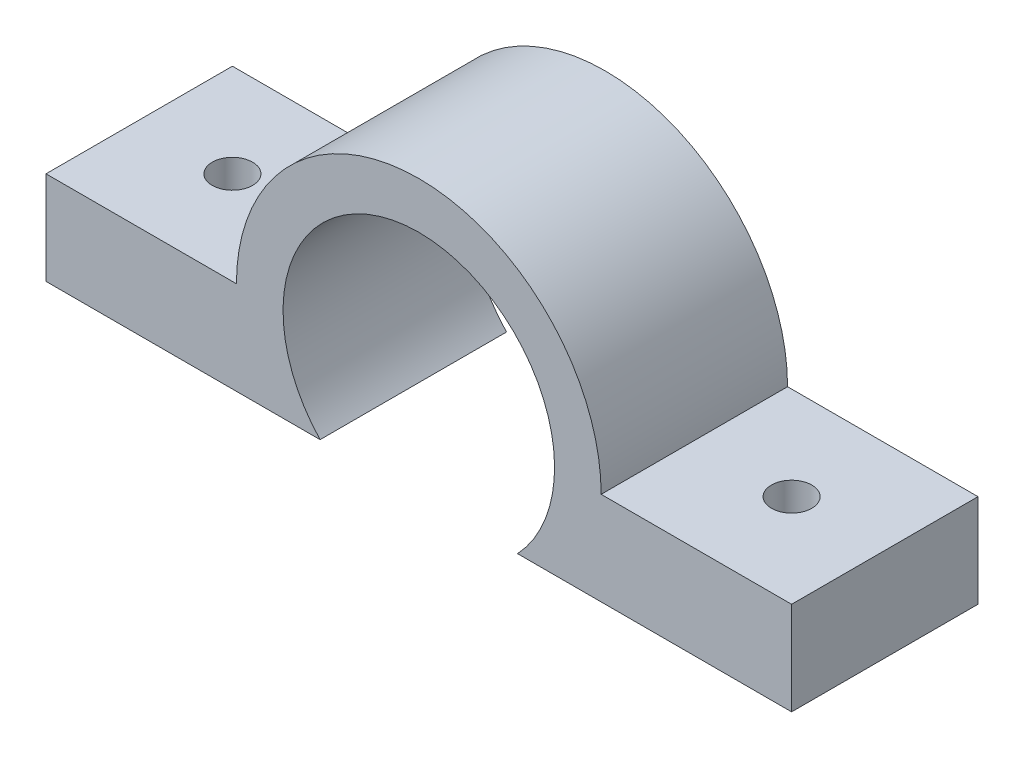
ISO-10303-21;
HEADER;
FILE_DESCRIPTION(('STEP AP214'),'2;1');
FILE_NAME('part.step','',(''),(''),'','','');
FILE_SCHEMA(('AUTOMOTIVE_DESIGN { 1 0 10303 214 1 1 1 1 }'));
ENDSEC;
DATA;
#1=APPLICATION_CONTEXT('core data for automotive mechanical design processes');
#2=APPLICATION_PROTOCOL_DEFINITION('international standard','automotive_design',2000,#1);
#3=PRODUCT_CONTEXT('',#1,'mechanical');
#4=PRODUCT('Part','Part','',(#3));
#5=PRODUCT_RELATED_PRODUCT_CATEGORY('part','',(#4));
#6=PRODUCT_DEFINITION_FORMATION('','',#4);
#7=PRODUCT_DEFINITION_CONTEXT('part definition',#1,'design');
#8=PRODUCT_DEFINITION('design','',#6,#7);
#9=PRODUCT_DEFINITION_SHAPE('','',#8);
#10=(LENGTH_UNIT() NAMED_UNIT(*) SI_UNIT(.MILLI.,.METRE.));
#11=(NAMED_UNIT(*) PLANE_ANGLE_UNIT() SI_UNIT($,.RADIAN.));
#12=(NAMED_UNIT(*) SI_UNIT($,.STERADIAN.) SOLID_ANGLE_UNIT());
#13=UNCERTAINTY_MEASURE_WITH_UNIT(LENGTH_MEASURE(1.E-05),#10,'distance_accuracy_value','');
#14=(GEOMETRIC_REPRESENTATION_CONTEXT(3) GLOBAL_UNCERTAINTY_ASSIGNED_CONTEXT((#13)) GLOBAL_UNIT_ASSIGNED_CONTEXT((#10,
#11,#12)) REPRESENTATION_CONTEXT('',''));
#15=CARTESIAN_POINT('',(0.,0.,0.));
#16=DIRECTION('',(0.,0.,1.));
#17=DIRECTION('',(1.,0.,0.));
#18=AXIS2_PLACEMENT_3D('',#15,#16,#17);
#19=CARTESIAN_POINT('',(0.,6.35,25.4));
#20=DIRECTION('',(0.,-1.,0.));
#21=DIRECTION('',(1.,0.,0.));
#22=AXIS2_PLACEMENT_3D('',#19,#20,#21);
#23=PLANE('',#22);
#24=CARTESIAN_POINT('',(-38.1,6.34999999999997,12.7));
#25=DIRECTION('',(0.,1.,0.));
#26=DIRECTION('',(0.,0.,1.));
#27=AXIS2_PLACEMENT_3D('',#24,#25,#26);
#28=CIRCLE('',#27,2.75);
#29=CARTESIAN_POINT('',(-38.1,6.34999999999997,15.45));
#30=VERTEX_POINT('',#29);
#31=EDGE_CURVE('E146',#30,#30,#28,.T.);
#32=ORIENTED_EDGE('',*,*,#31,.T.);
#33=EDGE_LOOP('',(#32));
#34=FACE_BOUND('',#33,.T.);
#35=DIRECTION('',(-1.,0.,0.));
#36=VECTOR('',#35,1.);
#37=CARTESIAN_POINT('',(0.,6.35,0.));
#38=LINE('',#37,#36);
#39=CARTESIAN_POINT('',(-13.4521373766402,6.35,0.));
#40=VERTEX_POINT('',#39);
#41=CARTESIAN_POINT('',(-50.8,6.34999999999999,0.));
#42=VERTEX_POINT('',#41);
#43=EDGE_CURVE('E141',#40,#42,#38,.T.);
#44=ORIENTED_EDGE('',*,*,#43,.F.);
#45=DIRECTION('',(0.,0.,-1.));
#46=VECTOR('',#45,1.);
#47=CARTESIAN_POINT('',(-13.4521373766402,6.35,25.4));
#48=LINE('',#47,#46);
#49=CARTESIAN_POINT('',(-13.4521373766402,6.35,25.4));
#50=VERTEX_POINT('',#49);
#51=EDGE_CURVE('E11',#50,#40,#48,.T.);
#52=ORIENTED_EDGE('',*,*,#51,.F.);
#53=DIRECTION('',(-1.,0.,0.));
#54=VECTOR('',#53,1.);
#55=CARTESIAN_POINT('',(0.,6.35,25.4));
#56=LINE('',#55,#54);
#57=CARTESIAN_POINT('',(-50.8,6.34999999999999,25.4));
#58=VERTEX_POINT('',#57);
#59=EDGE_CURVE('E167',#50,#58,#56,.T.);
#60=ORIENTED_EDGE('',*,*,#59,.T.);
#61=DIRECTION('',(0.,0.,-1.));
#62=VECTOR('',#61,1.);
#63=CARTESIAN_POINT('',(-50.8,6.34999999999999,25.4));
#64=LINE('',#63,#62);
#65=EDGE_CURVE('E93',#58,#42,#64,.T.);
#66=ORIENTED_EDGE('',*,*,#65,.T.);
#67=EDGE_LOOP('',(#44,#52,#60,#66));
#68=FACE_BOUND('',#67,.T.);
#69=ADVANCED_FACE('F41',(#34,#68),#23,.T.);
#70=CARTESIAN_POINT('',(0.,19.05,25.4));
#71=DIRECTION('',(0.,0.,-1.));
#72=DIRECTION('',(-1.,0.,0.));
#73=AXIS2_PLACEMENT_3D('',#70,#71,#72);
#74=CYLINDRICAL_SURFACE('',#73,18.5);
#75=CARTESIAN_POINT('',(0.,19.05,0.));
#76=DIRECTION('',(0.,0.,1.));
#77=DIRECTION('',(1.,0.,0.));
#78=AXIS2_PLACEMENT_3D('',#75,#76,#77);
#79=CIRCLE('',#78,18.5);
#80=CARTESIAN_POINT('',(13.4521373766402,6.35,0.));
#81=VERTEX_POINT('',#80);
#82=EDGE_CURVE('E145',#40,#81,#79,.F.);
#83=ORIENTED_EDGE('',*,*,#82,.T.);
#84=DIRECTION('',(0.,0.,-1.));
#85=VECTOR('',#84,1.);
#86=CARTESIAN_POINT('',(13.4521373766402,6.35,25.4));
#87=LINE('',#86,#85);
#88=CARTESIAN_POINT('',(13.4521373766402,6.35,25.4));
#89=VERTEX_POINT('',#88);
#90=EDGE_CURVE('E51',#89,#81,#87,.T.);
#91=ORIENTED_EDGE('',*,*,#90,.F.);
#92=CARTESIAN_POINT('',(0.,19.05,25.4));
#93=DIRECTION('',(0.,0.,1.));
#94=DIRECTION('',(1.,0.,0.));
#95=AXIS2_PLACEMENT_3D('',#92,#93,#94);
#96=CIRCLE('',#95,18.5);
#97=EDGE_CURVE('E214',#50,#89,#96,.F.);
#98=ORIENTED_EDGE('',*,*,#97,.F.);
#99=ORIENTED_EDGE('',*,*,#51,.T.);
#100=EDGE_LOOP('',(#83,#91,#98,#99));
#101=FACE_BOUND('',#100,.T.);
#102=ADVANCED_FACE('F43',(#101),#74,.F.);
#103=CARTESIAN_POINT('',(38.1,6.35000000000001,12.7));
#104=DIRECTION('',(0.,1.,0.));
#105=DIRECTION('',(0.,0.,1.));
#106=AXIS2_PLACEMENT_3D('',#103,#104,#105);
#107=CIRCLE('',#106,2.75);
#108=CARTESIAN_POINT('',(38.1,6.35000000000001,15.45));
#109=VERTEX_POINT('',#108);
#110=EDGE_CURVE('E201',#109,#109,#107,.T.);
#111=ORIENTED_EDGE('',*,*,#110,.T.);
#112=EDGE_LOOP('',(#111));
#113=FACE_BOUND('',#112,.T.);
#114=CARTESIAN_POINT('',(50.8,6.35000000000001,0.));
#115=VERTEX_POINT('',#114);
#116=EDGE_CURVE('E147',#115,#81,#38,.T.);
#117=ORIENTED_EDGE('',*,*,#116,.F.);
#118=DIRECTION('',(0.,0.,-1.));
#119=VECTOR('',#118,1.);
#120=CARTESIAN_POINT('',(50.8,6.35000000000001,25.4));
#121=LINE('',#120,#119);
#122=CARTESIAN_POINT('',(50.8,6.35000000000001,25.4));
#123=VERTEX_POINT('',#122);
#124=EDGE_CURVE('E177',#123,#115,#121,.T.);
#125=ORIENTED_EDGE('',*,*,#124,.F.);
#126=EDGE_CURVE('E187',#123,#89,#56,.T.);
#127=ORIENTED_EDGE('',*,*,#126,.T.);
#128=ORIENTED_EDGE('',*,*,#90,.T.);
#129=EDGE_LOOP('',(#117,#125,#127,#128));
#130=FACE_BOUND('',#129,.T.);
#131=ADVANCED_FACE('F184',(#113,#130),#23,.T.);
#132=CARTESIAN_POINT('',(50.8,0.,25.4));
#133=DIRECTION('',(1.,0.,0.));
#134=DIRECTION('',(0.,0.,-1.));
#135=AXIS2_PLACEMENT_3D('',#132,#133,#134);
#136=PLANE('',#135);
#137=DIRECTION('',(0.,-1.,0.));
#138=VECTOR('',#137,1.);
#139=CARTESIAN_POINT('',(50.8,0.,0.));
#140=LINE('',#139,#138);
#141=CARTESIAN_POINT('',(50.8,19.05,0.));
#142=VERTEX_POINT('',#141);
#143=EDGE_CURVE('E151',#142,#115,#140,.T.);
#144=ORIENTED_EDGE('',*,*,#143,.F.);
#145=DIRECTION('',(0.,0.,-1.));
#146=VECTOR('',#145,1.);
#147=CARTESIAN_POINT('',(50.8,19.05,25.4));
#148=LINE('',#147,#146);
#149=CARTESIAN_POINT('',(50.8,19.05,25.4));
#150=VERTEX_POINT('',#149);
#151=EDGE_CURVE('E174',#150,#142,#148,.T.);
#152=ORIENTED_EDGE('',*,*,#151,.F.);
#153=DIRECTION('',(0.,-1.,0.));
#154=VECTOR('',#153,1.);
#155=CARTESIAN_POINT('',(50.8,0.,25.4));
#156=LINE('',#155,#154);
#157=EDGE_CURVE('E217',#150,#123,#156,.T.);
#158=ORIENTED_EDGE('',*,*,#157,.T.);
#159=ORIENTED_EDGE('',*,*,#124,.T.);
#160=EDGE_LOOP('',(#144,#152,#158,#159));
#161=FACE_BOUND('',#160,.T.);
#162=ADVANCED_FACE('F227',(#161),#136,.T.);
#163=CARTESIAN_POINT('',(0.,19.05,25.4));
#164=DIRECTION('',(0.,1.,0.));
#165=DIRECTION('',(0.,0.,1.));
#166=AXIS2_PLACEMENT_3D('',#163,#164,#165);
#167=PLANE('',#166);
#168=CARTESIAN_POINT('',(38.1,19.05,12.7));
#169=DIRECTION('',(0.,1.,0.));
#170=DIRECTION('',(0.,0.,1.));
#171=AXIS2_PLACEMENT_3D('',#168,#169,#170);
#172=CIRCLE('',#171,2.74999999999999);
#173=CARTESIAN_POINT('',(38.1,19.05,15.45));
#174=VERTEX_POINT('',#173);
#175=EDGE_CURVE('E205',#174,#174,#172,.T.);
#176=ORIENTED_EDGE('',*,*,#175,.F.);
#177=EDGE_LOOP('',(#176));
#178=FACE_BOUND('',#177,.T.);
#179=DIRECTION('',(1.,0.,0.));
#180=VECTOR('',#179,1.);
#181=CARTESIAN_POINT('',(0.,19.05,0.));
#182=LINE('',#181,#180);
#183=CARTESIAN_POINT('',(24.85,19.05,0.));
#184=VERTEX_POINT('',#183);
#185=EDGE_CURVE('E155',#184,#142,#182,.T.);
#186=ORIENTED_EDGE('',*,*,#185,.F.);
#187=DIRECTION('',(0.,0.,-1.));
#188=VECTOR('',#187,1.);
#189=CARTESIAN_POINT('',(24.85,19.05,25.4));
#190=LINE('',#189,#188);
#191=CARTESIAN_POINT('',(24.85,19.05,25.4));
#192=VERTEX_POINT('',#191);
#193=EDGE_CURVE('E124',#192,#184,#190,.T.);
#194=ORIENTED_EDGE('',*,*,#193,.F.);
#195=DIRECTION('',(1.,0.,0.));
#196=VECTOR('',#195,1.);
#197=CARTESIAN_POINT('',(0.,19.05,25.4));
#198=LINE('',#197,#196);
#199=EDGE_CURVE('E131',#192,#150,#198,.T.);
#200=ORIENTED_EDGE('',*,*,#199,.T.);
#201=ORIENTED_EDGE('',*,*,#151,.T.);
#202=EDGE_LOOP('',(#186,#194,#200,#201));
#203=FACE_BOUND('',#202,.T.);
#204=ADVANCED_FACE('F223',(#178,#203),#167,.T.);
#205=CARTESIAN_POINT('',(0.,19.05,25.4));
#206=DIRECTION('',(0.,0.,-1.));
#207=DIRECTION('',(-1.,0.,0.));
#208=AXIS2_PLACEMENT_3D('',#205,#206,#207);
#209=CYLINDRICAL_SURFACE('',#208,24.85);
#210=CARTESIAN_POINT('',(0.,19.05,0.));
#211=DIRECTION('',(0.,0.,1.));
#212=DIRECTION('',(1.,0.,0.));
#213=AXIS2_PLACEMENT_3D('',#210,#211,#212);
#214=CIRCLE('',#213,24.85);
#215=CARTESIAN_POINT('',(-24.85,19.05,0.));
#216=VERTEX_POINT('',#215);
#217=EDGE_CURVE('E118',#216,#184,#214,.F.);
#218=ORIENTED_EDGE('',*,*,#217,.F.);
#219=DIRECTION('',(0.,0.,-1.));
#220=VECTOR('',#219,1.);
#221=CARTESIAN_POINT('',(-24.85,19.05,25.4));
#222=LINE('',#221,#220);
#223=CARTESIAN_POINT('',(-24.85,19.05,25.4));
#224=VERTEX_POINT('',#223);
#225=EDGE_CURVE('E113',#224,#216,#222,.T.);
#226=ORIENTED_EDGE('',*,*,#225,.F.);
#227=CARTESIAN_POINT('',(0.,19.05,25.4));
#228=DIRECTION('',(0.,0.,1.));
#229=DIRECTION('',(1.,0.,0.));
#230=AXIS2_PLACEMENT_3D('',#227,#228,#229);
#231=CIRCLE('',#230,24.85);
#232=EDGE_CURVE('E116',#224,#192,#231,.F.);
#233=ORIENTED_EDGE('',*,*,#232,.T.);
#234=ORIENTED_EDGE('',*,*,#193,.T.);
#235=EDGE_LOOP('',(#218,#226,#233,#234));
#236=FACE_BOUND('',#235,.T.);
#237=ADVANCED_FACE('F115',(#236),#209,.T.);
#238=CARTESIAN_POINT('',(0.,19.05,25.4));
#239=DIRECTION('',(0.,1.,0.));
#240=DIRECTION('',(-1.,0.,0.));
#241=AXIS2_PLACEMENT_3D('',#238,#239,#240);
#242=PLANE('',#241);
#243=CARTESIAN_POINT('',(-38.1,19.05,12.7));
#244=DIRECTION('',(0.,1.,0.));
#245=DIRECTION('',(0.,0.,1.));
#246=AXIS2_PLACEMENT_3D('',#243,#244,#245);
#247=CIRCLE('',#246,2.74999999999999);
#248=CARTESIAN_POINT('',(-38.1,19.05,15.45));
#249=VERTEX_POINT('',#248);
#250=EDGE_CURVE('E197',#249,#249,#247,.T.);
#251=ORIENTED_EDGE('',*,*,#250,.F.);
#252=EDGE_LOOP('',(#251));
#253=FACE_BOUND('',#252,.T.);
#254=DIRECTION('',(1.,0.,0.));
#255=VECTOR('',#254,1.);
#256=CARTESIAN_POINT('',(0.,19.05,0.));
#257=LINE('',#256,#255);
#258=CARTESIAN_POINT('',(-50.8,19.05,0.));
#259=VERTEX_POINT('',#258);
#260=EDGE_CURVE('E161',#259,#216,#257,.T.);
#261=ORIENTED_EDGE('',*,*,#260,.F.);
#262=DIRECTION('',(0.,0.,-1.));
#263=VECTOR('',#262,1.);
#264=CARTESIAN_POINT('',(-50.8,19.05,25.4));
#265=LINE('',#264,#263);
#266=CARTESIAN_POINT('',(-50.8,19.05,25.4));
#267=VERTEX_POINT('',#266);
#268=EDGE_CURVE('E86',#267,#259,#265,.T.);
#269=ORIENTED_EDGE('',*,*,#268,.F.);
#270=DIRECTION('',(1.,0.,0.));
#271=VECTOR('',#270,1.);
#272=CARTESIAN_POINT('',(0.,19.05,25.4));
#273=LINE('',#272,#271);
#274=EDGE_CURVE('E128',#267,#224,#273,.T.);
#275=ORIENTED_EDGE('',*,*,#274,.T.);
#276=ORIENTED_EDGE('',*,*,#225,.T.);
#277=EDGE_LOOP('',(#261,#269,#275,#276));
#278=FACE_BOUND('',#277,.T.);
#279=ADVANCED_FACE('F134',(#253,#278),#242,.T.);
#280=CARTESIAN_POINT('',(-50.8,0.,25.4));
#281=DIRECTION('',(1.,0.,0.));
#282=DIRECTION('',(0.,0.,-1.));
#283=AXIS2_PLACEMENT_3D('',#280,#281,#282);
#284=PLANE('',#283);
#285=DIRECTION('',(0.,-1.,0.));
#286=VECTOR('',#285,1.);
#287=CARTESIAN_POINT('',(-50.8,0.,0.));
#288=LINE('',#287,#286);
#289=EDGE_CURVE('E164',#259,#42,#288,.T.);
#290=ORIENTED_EDGE('',*,*,#289,.T.);
#291=ORIENTED_EDGE('',*,*,#65,.F.);
#292=DIRECTION('',(0.,-1.,0.));
#293=VECTOR('',#292,1.);
#294=CARTESIAN_POINT('',(-50.8,0.,25.4));
#295=LINE('',#294,#293);
#296=EDGE_CURVE('E59',#267,#58,#295,.T.);
#297=ORIENTED_EDGE('',*,*,#296,.F.);
#298=ORIENTED_EDGE('',*,*,#268,.T.);
#299=EDGE_LOOP('',(#290,#291,#297,#298));
#300=FACE_BOUND('',#299,.T.);
#301=ADVANCED_FACE('F224',(#300),#284,.F.);
#302=CARTESIAN_POINT('',(0.,0.,25.4));
#303=DIRECTION('',(0.,0.,1.));
#304=DIRECTION('',(1.,0.,0.));
#305=AXIS2_PLACEMENT_3D('',#302,#303,#304);
#306=PLANE('',#305);
#307=ORIENTED_EDGE('',*,*,#59,.F.);
#308=ORIENTED_EDGE('',*,*,#97,.T.);
#309=ORIENTED_EDGE('',*,*,#126,.F.);
#310=ORIENTED_EDGE('',*,*,#157,.F.);
#311=ORIENTED_EDGE('',*,*,#199,.F.);
#312=ORIENTED_EDGE('',*,*,#232,.F.);
#313=ORIENTED_EDGE('',*,*,#274,.F.);
#314=ORIENTED_EDGE('',*,*,#296,.T.);
#315=EDGE_LOOP('',(#307,#308,#309,#310,#311,#312,#313,#314));
#316=FACE_BOUND('',#315,.T.);
#317=ADVANCED_FACE('F127',(#316),#306,.T.);
#318=CARTESIAN_POINT('',(0.,0.,0.));
#319=DIRECTION('',(0.,0.,1.));
#320=DIRECTION('',(1.,0.,0.));
#321=AXIS2_PLACEMENT_3D('',#318,#319,#320);
#322=PLANE('',#321);
#323=ORIENTED_EDGE('',*,*,#43,.T.);
#324=ORIENTED_EDGE('',*,*,#289,.F.);
#325=ORIENTED_EDGE('',*,*,#260,.T.);
#326=ORIENTED_EDGE('',*,*,#217,.T.);
#327=ORIENTED_EDGE('',*,*,#185,.T.);
#328=ORIENTED_EDGE('',*,*,#143,.T.);
#329=ORIENTED_EDGE('',*,*,#116,.T.);
#330=ORIENTED_EDGE('',*,*,#82,.F.);
#331=EDGE_LOOP('',(#323,#324,#325,#326,#327,#328,#329,#330));
#332=FACE_BOUND('',#331,.T.);
#333=ADVANCED_FACE('F191',(#332),#322,.F.);
#334=CARTESIAN_POINT('',(-38.1,19.05,12.7));
#335=DIRECTION('',(0.,1.,0.));
#336=DIRECTION('',(0.,0.,1.));
#337=AXIS2_PLACEMENT_3D('',#334,#335,#336);
#338=CYLINDRICAL_SURFACE('',#337,2.74999999999999);
#339=ORIENTED_EDGE('',*,*,#31,.F.);
#340=EDGE_LOOP('',(#339));
#341=FACE_BOUND('',#340,.T.);
#342=ORIENTED_EDGE('',*,*,#250,.T.);
#343=EDGE_LOOP('',(#342));
#344=FACE_BOUND('',#343,.T.);
#345=ADVANCED_FACE('F244',(#341,#344),#338,.F.);
#346=CARTESIAN_POINT('',(38.1,19.05,12.7));
#347=DIRECTION('',(0.,1.,0.));
#348=DIRECTION('',(0.,0.,1.));
#349=AXIS2_PLACEMENT_3D('',#346,#347,#348);
#350=CYLINDRICAL_SURFACE('',#349,2.74999999999999);
#351=ORIENTED_EDGE('',*,*,#110,.F.);
#352=EDGE_LOOP('',(#351));
#353=FACE_BOUND('',#352,.T.);
#354=ORIENTED_EDGE('',*,*,#175,.T.);
#355=EDGE_LOOP('',(#354));
#356=FACE_BOUND('',#355,.T.);
#357=ADVANCED_FACE('F247',(#353,#356),#350,.F.);
#358=CLOSED_SHELL('',(#69,#102,#131,#162,#204,#237,#279,#301,#317,#333,#345,#357));
#359=MANIFOLD_SOLID_BREP('B2',#358);
#360=ADVANCED_BREP_SHAPE_REPRESENTATION('',(#18,#359),#14);
#361=SHAPE_DEFINITION_REPRESENTATION(#9,#360);
ENDSEC;
END-ISO-10303-21;
